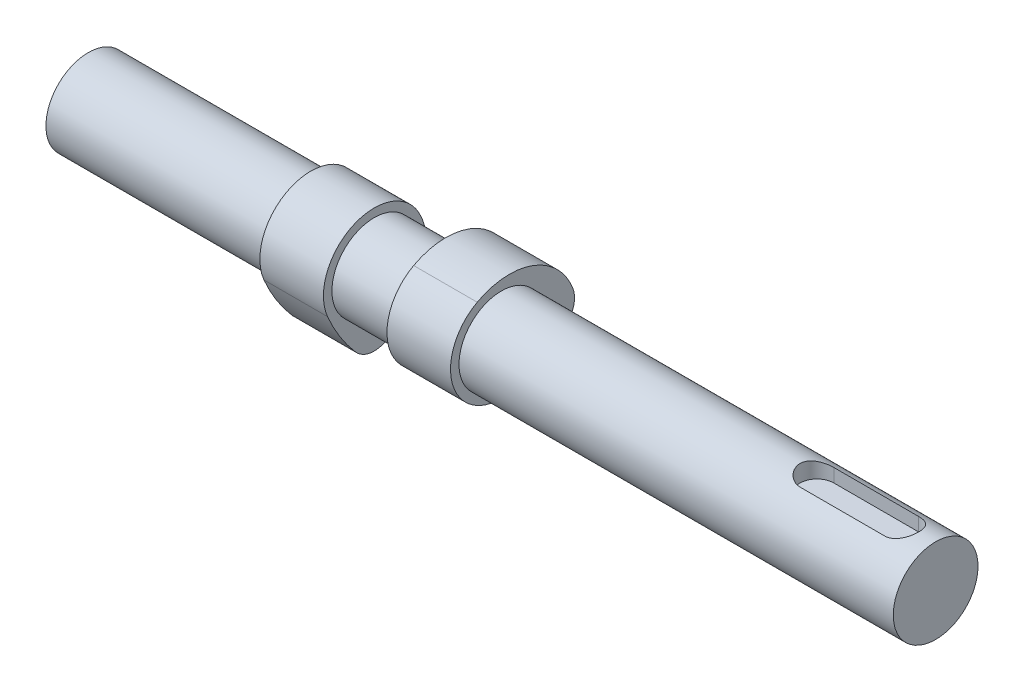
ISO-10303-21;
HEADER;
FILE_DESCRIPTION(('STEP AP214'),'2;1');
FILE_NAME('part.step','',(''),(''),'','','');
FILE_SCHEMA(('AUTOMOTIVE_DESIGN { 1 0 10303 214 1 1 1 1 }'));
ENDSEC;
DATA;
#1=APPLICATION_CONTEXT('core data for automotive mechanical design processes');
#2=APPLICATION_PROTOCOL_DEFINITION('international standard','automotive_design',2000,#1);
#3=PRODUCT_CONTEXT('',#1,'mechanical');
#4=PRODUCT('Part','Part','',(#3));
#5=PRODUCT_RELATED_PRODUCT_CATEGORY('part','',(#4));
#6=PRODUCT_DEFINITION_FORMATION('','',#4);
#7=PRODUCT_DEFINITION_CONTEXT('part definition',#1,'design');
#8=PRODUCT_DEFINITION('design','',#6,#7);
#9=PRODUCT_DEFINITION_SHAPE('','',#8);
#10=(LENGTH_UNIT() NAMED_UNIT(*) SI_UNIT(.MILLI.,.METRE.));
#11=(NAMED_UNIT(*) PLANE_ANGLE_UNIT() SI_UNIT($,.RADIAN.));
#12=(NAMED_UNIT(*) SI_UNIT($,.STERADIAN.) SOLID_ANGLE_UNIT());
#13=UNCERTAINTY_MEASURE_WITH_UNIT(LENGTH_MEASURE(1.E-05),#10,'distance_accuracy_value','');
#14=(GEOMETRIC_REPRESENTATION_CONTEXT(3) GLOBAL_UNCERTAINTY_ASSIGNED_CONTEXT((#13)) GLOBAL_UNIT_ASSIGNED_CONTEXT((#10,
#11,#12)) REPRESENTATION_CONTEXT('',''));
#15=CARTESIAN_POINT('',(0.,0.,0.));
#16=DIRECTION('',(0.,0.,1.));
#17=DIRECTION('',(1.,0.,0.));
#18=AXIS2_PLACEMENT_3D('',#15,#16,#17);
#19=CARTESIAN_POINT('',(-22.5,-1.90083734531653,3.51949106926698));
#20=DIRECTION('',(1.,0.,0.));
#21=DIRECTION('',(0.,1.,0.));
#22=AXIS2_PLACEMENT_3D('',#19,#20,#21);
#23=CYLINDRICAL_SURFACE('',#22,16.);
#24=CARTESIAN_POINT('',(-7.5,-1.90083734531653,3.51949106926698));
#25=DIRECTION('',(1.,0.,0.));
#26=DIRECTION('',(0.,1.,0.));
#27=AXIS2_PLACEMENT_3D('',#24,#25,#26);
#28=CIRCLE('',#27,16.);
#29=CARTESIAN_POINT('',(-7.5,-16.9082165253208,-2.0283526693017));
#30=VERTEX_POINT('',#29);
#31=CARTESIAN_POINT('',(-7.5,5.70251203594959,-10.5584732078009));
#32=VERTEX_POINT('',#31);
#33=EDGE_CURVE('E121',#30,#32,#28,.T.);
#34=ORIENTED_EDGE('',*,*,#33,.F.);
#35=DIRECTION('',(1.,0.,0.));
#36=VECTOR('',#35,1.);
#37=CARTESIAN_POINT('',(-22.5,-16.9082165253208,-2.0283526693017));
#38=LINE('',#37,#36);
#39=CARTESIAN_POINT('',(-22.5,-16.9082165253208,-2.0283526693017));
#40=VERTEX_POINT('',#39);
#41=EDGE_CURVE('E120',#40,#30,#38,.T.);
#42=ORIENTED_EDGE('',*,*,#41,.F.);
#43=CARTESIAN_POINT('',(-22.5,-1.90083734531653,3.51949106926698));
#44=DIRECTION('',(1.,0.,0.));
#45=DIRECTION('',(0.,1.,0.));
#46=AXIS2_PLACEMENT_3D('',#43,#44,#45);
#47=CIRCLE('',#46,16.);
#48=CARTESIAN_POINT('',(-22.5,5.70251203594959,-10.5584732078009));
#49=VERTEX_POINT('',#48);
#50=EDGE_CURVE('E115',#40,#49,#47,.T.);
#51=ORIENTED_EDGE('',*,*,#50,.T.);
#52=DIRECTION('',(1.,0.,0.));
#53=VECTOR('',#52,1.);
#54=CARTESIAN_POINT('',(-22.5,5.70251203594959,-10.5584732078009));
#55=LINE('',#54,#53);
#56=EDGE_CURVE('E12',#49,#32,#55,.T.);
#57=ORIENTED_EDGE('',*,*,#56,.T.);
#58=EDGE_LOOP('',(#34,#42,#51,#57));
#59=FACE_BOUND('',#58,.T.);
#60=ADVANCED_FACE('F58',(#59),#23,.T.);
#61=CARTESIAN_POINT('',(-22.5,0.,0.));
#62=DIRECTION('',(1.,0.,0.));
#63=DIRECTION('',(0.,1.,0.));
#64=AXIS2_PLACEMENT_3D('',#61,#62,#63);
#65=CYLINDRICAL_SURFACE('',#64,12.);
#66=CARTESIAN_POINT('',(-7.5,0.,0.));
#67=DIRECTION('',(1.,0.,0.));
#68=DIRECTION('',(0.,-1.,0.));
#69=AXIS2_PLACEMENT_3D('',#66,#67,#68);
#70=CIRCLE('',#69,12.);
#71=CARTESIAN_POINT('',(-7.5,-4.72405507257353,11.0310155321843));
#72=VERTEX_POINT('',#71);
#73=EDGE_CURVE('E123',#32,#72,#70,.T.);
#74=ORIENTED_EDGE('',*,*,#73,.F.);
#75=ORIENTED_EDGE('',*,*,#56,.F.);
#76=CARTESIAN_POINT('',(-22.5,0.,0.));
#77=DIRECTION('',(1.,0.,0.));
#78=DIRECTION('',(0.,-1.,0.));
#79=AXIS2_PLACEMENT_3D('',#76,#77,#78);
#80=CIRCLE('',#79,12.);
#81=CARTESIAN_POINT('',(-22.5,-4.72405507257353,11.0310155321843));
#82=VERTEX_POINT('',#81);
#83=EDGE_CURVE('E99',#49,#82,#80,.T.);
#84=ORIENTED_EDGE('',*,*,#83,.T.);
#85=DIRECTION('',(1.,0.,0.));
#86=VECTOR('',#85,1.);
#87=CARTESIAN_POINT('',(-22.5,-4.72405507257353,11.0310155321843));
#88=LINE('',#87,#86);
#89=EDGE_CURVE('E66',#82,#72,#88,.T.);
#90=ORIENTED_EDGE('',*,*,#89,.T.);
#91=EDGE_LOOP('',(#74,#75,#84,#90));
#92=FACE_BOUND('',#91,.T.);
#93=ADVANCED_FACE('F113',(#92),#65,.T.);
#94=CARTESIAN_POINT('',(-22.5,11.0227951693382,-25.7390362417635));
#95=DIRECTION('',(1.,0.,0.));
#96=DIRECTION('',(0.,1.,0.));
#97=AXIS2_PLACEMENT_3D('',#94,#95,#96);
#98=CYLINDRICAL_SURFACE('',#97,40.);
#99=CARTESIAN_POINT('',(-7.5,11.0227951693382,-25.7390362417635));
#100=DIRECTION('',(1.,0.,0.));
#101=DIRECTION('',(0.,-1.,0.));
#102=AXIS2_PLACEMENT_3D('',#99,#100,#101);
#103=CIRCLE('',#102,40.);
#104=CARTESIAN_POINT('',(-7.5,-15.2659329020058,4.40897822670404));
#105=VERTEX_POINT('',#104);
#106=EDGE_CURVE('E109',#72,#105,#103,.T.);
#107=ORIENTED_EDGE('',*,*,#106,.F.);
#108=ORIENTED_EDGE('',*,*,#89,.F.);
#109=CARTESIAN_POINT('',(-22.5,11.0227951693382,-25.7390362417635));
#110=DIRECTION('',(1.,0.,0.));
#111=DIRECTION('',(0.,-1.,0.));
#112=AXIS2_PLACEMENT_3D('',#109,#110,#111);
#113=CIRCLE('',#112,40.);
#114=CARTESIAN_POINT('',(-22.5,-15.2659329020058,4.40897822670404));
#115=VERTEX_POINT('',#114);
#116=EDGE_CURVE('E102',#82,#115,#113,.T.);
#117=ORIENTED_EDGE('',*,*,#116,.T.);
#118=DIRECTION('',(1.,0.,0.));
#119=VECTOR('',#118,1.);
#120=CARTESIAN_POINT('',(-22.5,-15.2659329020058,4.40897822670404));
#121=LINE('',#120,#119);
#122=EDGE_CURVE('E112',#115,#105,#121,.T.);
#123=ORIENTED_EDGE('',*,*,#122,.T.);
#124=EDGE_LOOP('',(#107,#108,#117,#123));
#125=FACE_BOUND('',#124,.T.);
#126=ADVANCED_FACE('F108',(#125),#98,.T.);
#127=CARTESIAN_POINT('',(-22.5,-11.4213536911418,0.));
#128=DIRECTION('',(1.,0.,0.));
#129=DIRECTION('',(0.,1.,0.));
#130=AXIS2_PLACEMENT_3D('',#127,#128,#129);
#131=CYLINDRICAL_SURFACE('',#130,5.84977591982444);
#132=CARTESIAN_POINT('',(-7.5,-11.4213536911418,0.));
#133=DIRECTION('',(1.,0.,0.));
#134=DIRECTION('',(0.,-1.,0.));
#135=AXIS2_PLACEMENT_3D('',#132,#133,#134);
#136=CIRCLE('',#135,5.84977591982444);
#137=EDGE_CURVE('E88',#105,#30,#136,.T.);
#138=ORIENTED_EDGE('',*,*,#137,.F.);
#139=ORIENTED_EDGE('',*,*,#122,.F.);
#140=CARTESIAN_POINT('',(-22.5,-11.4213536911418,0.));
#141=DIRECTION('',(1.,0.,0.));
#142=DIRECTION('',(0.,-1.,0.));
#143=AXIS2_PLACEMENT_3D('',#140,#141,#142);
#144=CIRCLE('',#143,5.84977591982444);
#145=EDGE_CURVE('E74',#115,#40,#144,.T.);
#146=ORIENTED_EDGE('',*,*,#145,.T.);
#147=ORIENTED_EDGE('',*,*,#41,.T.);
#148=EDGE_LOOP('',(#138,#139,#146,#147));
#149=FACE_BOUND('',#148,.T.);
#150=ADVANCED_FACE('F132',(#149),#131,.T.);
#151=CARTESIAN_POINT('',(-22.5,-6.66109551822916,1.75974553463351));
#152=DIRECTION('',(1.,0.,0.));
#153=DIRECTION('',(0.,1.,0.));
#154=AXIS2_PLACEMENT_3D('',#151,#152,#153);
#155=PLANE('',#154);
#156=ORIENTED_EDGE('',*,*,#50,.F.);
#157=ORIENTED_EDGE('',*,*,#145,.F.);
#158=ORIENTED_EDGE('',*,*,#116,.F.);
#159=ORIENTED_EDGE('',*,*,#83,.F.);
#160=EDGE_LOOP('',(#156,#157,#158,#159));
#161=FACE_BOUND('',#160,.T.);
#162=ADVANCED_FACE('F104',(#161),#155,.F.);
#163=CARTESIAN_POINT('',(-7.5,-6.66109551822916,1.75974553463351));
#164=DIRECTION('',(1.,0.,0.));
#165=DIRECTION('',(0.,1.,0.));
#166=AXIS2_PLACEMENT_3D('',#163,#164,#165);
#167=PLANE('',#166);
#168=ORIENTED_EDGE('',*,*,#33,.T.);
#169=ORIENTED_EDGE('',*,*,#73,.T.);
#170=ORIENTED_EDGE('',*,*,#106,.T.);
#171=ORIENTED_EDGE('',*,*,#137,.T.);
#172=EDGE_LOOP('',(#168,#169,#170,#171));
#173=FACE_BOUND('',#172,.T.);
#174=ADVANCED_FACE('F128',(#173),#167,.T.);
#175=CLOSED_SHELL('',(#60,#93,#126,#150,#162,#174));
#176=MANIFOLD_SOLID_BREP('B2',#175);
#177=CARTESIAN_POINT('',(22.5,-3.51949106926697,-1.90083734531654));
#178=DIRECTION('',(-1.,0.,0.));
#179=DIRECTION('',(0.,0.,1.));
#180=AXIS2_PLACEMENT_3D('',#177,#178,#179);
#181=CYLINDRICAL_SURFACE('',#180,16.);
#182=CARTESIAN_POINT('',(7.5,-3.51949106926697,-1.90083734531654));
#183=DIRECTION('',(1.,0.,0.));
#184=DIRECTION('',(0.,0.,1.));
#185=AXIS2_PLACEMENT_3D('',#182,#183,#184);
#186=CIRCLE('',#185,16.);
#187=CARTESIAN_POINT('',(7.5,2.02835266930176,-16.9082165253207));
#188=VERTEX_POINT('',#187);
#189=CARTESIAN_POINT('',(7.5,10.5584732078009,5.70251203594963));
#190=VERTEX_POINT('',#189);
#191=EDGE_CURVE('E290',#188,#190,#186,.T.);
#192=ORIENTED_EDGE('',*,*,#191,.T.);
#193=DIRECTION('',(-1.,0.,0.));
#194=VECTOR('',#193,1.);
#195=CARTESIAN_POINT('',(22.5,10.5584732078009,5.70251203594963));
#196=LINE('',#195,#194);
#197=CARTESIAN_POINT('',(22.5,10.5584732078009,5.70251203594963));
#198=VERTEX_POINT('',#197);
#199=EDGE_CURVE('E56',#198,#190,#196,.T.);
#200=ORIENTED_EDGE('',*,*,#199,.F.);
#201=CARTESIAN_POINT('',(22.5,-3.51949106926697,-1.90083734531654));
#202=DIRECTION('',(1.,0.,0.));
#203=DIRECTION('',(0.,0.,1.));
#204=AXIS2_PLACEMENT_3D('',#201,#202,#203);
#205=CIRCLE('',#204,16.);
#206=CARTESIAN_POINT('',(22.5,2.02835266930176,-16.9082165253207));
#207=VERTEX_POINT('',#206);
#208=EDGE_CURVE('E278',#207,#198,#205,.T.);
#209=ORIENTED_EDGE('',*,*,#208,.F.);
#210=DIRECTION('',(-1.,0.,0.));
#211=VECTOR('',#210,1.);
#212=CARTESIAN_POINT('',(22.5,2.02835266930176,-16.9082165253207));
#213=LINE('',#212,#211);
#214=EDGE_CURVE('E286',#207,#188,#213,.T.);
#215=ORIENTED_EDGE('',*,*,#214,.T.);
#216=EDGE_LOOP('',(#192,#200,#209,#215));
#217=FACE_BOUND('',#216,.T.);
#218=ADVANCED_FACE('F227',(#217),#181,.T.);
#219=CARTESIAN_POINT('',(22.5,0.,0.));
#220=DIRECTION('',(-1.,0.,0.));
#221=DIRECTION('',(0.,0.,1.));
#222=AXIS2_PLACEMENT_3D('',#219,#220,#221);
#223=CYLINDRICAL_SURFACE('',#222,12.);
#224=CARTESIAN_POINT('',(7.5,0.,0.));
#225=DIRECTION('',(1.,0.,0.));
#226=DIRECTION('',(0.,0.,-1.));
#227=AXIS2_PLACEMENT_3D('',#224,#225,#226);
#228=CIRCLE('',#227,12.);
#229=CARTESIAN_POINT('',(7.5,-11.0310155321843,-4.72405507257357));
#230=VERTEX_POINT('',#229);
#231=EDGE_CURVE('E282',#190,#230,#228,.T.);
#232=ORIENTED_EDGE('',*,*,#231,.T.);
#233=DIRECTION('',(-1.,0.,0.));
#234=VECTOR('',#233,1.);
#235=CARTESIAN_POINT('',(22.5,-11.0310155321843,-4.72405507257357));
#236=LINE('',#235,#234);
#237=CARTESIAN_POINT('',(22.5,-11.0310155321843,-4.72405507257357));
#238=VERTEX_POINT('',#237);
#239=EDGE_CURVE('E235',#238,#230,#236,.T.);
#240=ORIENTED_EDGE('',*,*,#239,.F.);
#241=CARTESIAN_POINT('',(22.5,0.,0.));
#242=DIRECTION('',(1.,0.,0.));
#243=DIRECTION('',(0.,0.,-1.));
#244=AXIS2_PLACEMENT_3D('',#241,#242,#243);
#245=CIRCLE('',#244,12.);
#246=EDGE_CURVE('E273',#198,#238,#245,.T.);
#247=ORIENTED_EDGE('',*,*,#246,.F.);
#248=ORIENTED_EDGE('',*,*,#199,.T.);
#249=EDGE_LOOP('',(#232,#240,#247,#248));
#250=FACE_BOUND('',#249,.T.);
#251=ADVANCED_FACE('F281',(#250),#223,.T.);
#252=CARTESIAN_POINT('',(22.5,25.7390362417634,11.0227951693383));
#253=DIRECTION('',(-1.,0.,0.));
#254=DIRECTION('',(0.,0.,1.));
#255=AXIS2_PLACEMENT_3D('',#252,#253,#254);
#256=CYLINDRICAL_SURFACE('',#255,40.);
#257=CARTESIAN_POINT('',(7.5,25.7390362417634,11.0227951693383));
#258=DIRECTION('',(1.,0.,0.));
#259=DIRECTION('',(0.,0.,-1.));
#260=AXIS2_PLACEMENT_3D('',#257,#258,#259);
#261=CIRCLE('',#260,40.);
#262=CARTESIAN_POINT('',(7.5,-4.40897822670399,-15.2659329020058));
#263=VERTEX_POINT('',#262);
#264=EDGE_CURVE('E260',#230,#263,#261,.T.);
#265=ORIENTED_EDGE('',*,*,#264,.T.);
#266=DIRECTION('',(-1.,0.,0.));
#267=VECTOR('',#266,1.);
#268=CARTESIAN_POINT('',(22.5,-4.40897822670399,-15.2659329020058));
#269=LINE('',#268,#267);
#270=CARTESIAN_POINT('',(22.5,-4.40897822670399,-15.2659329020058));
#271=VERTEX_POINT('',#270);
#272=EDGE_CURVE('E283',#271,#263,#269,.T.);
#273=ORIENTED_EDGE('',*,*,#272,.F.);
#274=CARTESIAN_POINT('',(22.5,25.7390362417634,11.0227951693383));
#275=DIRECTION('',(1.,0.,0.));
#276=DIRECTION('',(0.,0.,-1.));
#277=AXIS2_PLACEMENT_3D('',#274,#275,#276);
#278=CIRCLE('',#277,40.);
#279=EDGE_CURVE('E276',#238,#271,#278,.T.);
#280=ORIENTED_EDGE('',*,*,#279,.F.);
#281=ORIENTED_EDGE('',*,*,#239,.T.);
#282=EDGE_LOOP('',(#265,#273,#280,#281));
#283=FACE_BOUND('',#282,.T.);
#284=ADVANCED_FACE('F284',(#283),#256,.T.);
#285=CARTESIAN_POINT('',(22.5,0.,-11.4213536911418));
#286=DIRECTION('',(-1.,0.,0.));
#287=DIRECTION('',(0.,0.,1.));
#288=AXIS2_PLACEMENT_3D('',#285,#286,#287);
#289=CYLINDRICAL_SURFACE('',#288,5.84977591982444);
#290=CARTESIAN_POINT('',(7.5,0.,-11.4213536911418));
#291=DIRECTION('',(1.,0.,0.));
#292=DIRECTION('',(0.,0.,-1.));
#293=AXIS2_PLACEMENT_3D('',#290,#291,#292);
#294=CIRCLE('',#293,5.84977591982444);
#295=EDGE_CURVE('E266',#263,#188,#294,.T.);
#296=ORIENTED_EDGE('',*,*,#295,.T.);
#297=ORIENTED_EDGE('',*,*,#214,.F.);
#298=CARTESIAN_POINT('',(22.5,0.,-11.4213536911418));
#299=DIRECTION('',(1.,0.,0.));
#300=DIRECTION('',(0.,0.,-1.));
#301=AXIS2_PLACEMENT_3D('',#298,#299,#300);
#302=CIRCLE('',#301,5.84977591982444);
#303=EDGE_CURVE('E243',#271,#207,#302,.T.);
#304=ORIENTED_EDGE('',*,*,#303,.F.);
#305=ORIENTED_EDGE('',*,*,#272,.T.);
#306=EDGE_LOOP('',(#296,#297,#304,#305));
#307=FACE_BOUND('',#306,.T.);
#308=ADVANCED_FACE('F297',(#307),#289,.T.);
#309=CARTESIAN_POINT('',(22.5,-1.75974553463348,-6.66109551822917));
#310=DIRECTION('',(-1.,0.,0.));
#311=DIRECTION('',(0.,0.,1.));
#312=AXIS2_PLACEMENT_3D('',#309,#310,#311);
#313=PLANE('',#312);
#314=ORIENTED_EDGE('',*,*,#208,.T.);
#315=ORIENTED_EDGE('',*,*,#246,.T.);
#316=ORIENTED_EDGE('',*,*,#279,.T.);
#317=ORIENTED_EDGE('',*,*,#303,.T.);
#318=EDGE_LOOP('',(#314,#315,#316,#317));
#319=FACE_BOUND('',#318,.T.);
#320=ADVANCED_FACE('F274',(#319),#313,.F.);
#321=CARTESIAN_POINT('',(7.5,-1.75974553463348,-6.66109551822917));
#322=DIRECTION('',(-1.,0.,0.));
#323=DIRECTION('',(0.,0.,1.));
#324=AXIS2_PLACEMENT_3D('',#321,#322,#323);
#325=PLANE('',#324);
#326=ORIENTED_EDGE('',*,*,#191,.F.);
#327=ORIENTED_EDGE('',*,*,#295,.F.);
#328=ORIENTED_EDGE('',*,*,#264,.F.);
#329=ORIENTED_EDGE('',*,*,#231,.F.);
#330=EDGE_LOOP('',(#326,#327,#328,#329));
#331=FACE_BOUND('',#330,.T.);
#332=ADVANCED_FACE('F300',(#331),#325,.T.);
#333=CLOSED_SHELL('',(#218,#251,#284,#308,#320,#332));
#334=MANIFOLD_SOLID_BREP('B6',#333);
#335=CARTESIAN_POINT('',(125.,0.,0.));
#336=DIRECTION('',(-1.,0.,0.));
#337=DIRECTION('',(0.,0.,1.));
#338=AXIS2_PLACEMENT_3D('',#335,#336,#337);
#339=CYLINDRICAL_SURFACE('',#338,10.);
#340=DIRECTION('',(-1.,0.,0.));
#341=VECTOR('',#340,1.);
#342=CARTESIAN_POINT('',(125.,9.16515138991168,4.));
#343=LINE('',#342,#341);
#344=CARTESIAN_POINT('',(117.,9.16515138991168,4.));
#345=VERTEX_POINT('',#344);
#346=CARTESIAN_POINT('',(97.,9.16515138991168,4.));
#347=VERTEX_POINT('',#346);
#348=EDGE_CURVE('E225',#345,#347,#343,.T.);
#349=ORIENTED_EDGE('',*,*,#348,.T.);
#350=CARTESIAN_POINT('',(97.,9.16515138991168,4.));
#351=CARTESIAN_POINT('',(96.8923882949458,9.16512928809544,4.00001596071938));
#352=CARTESIAN_POINT('',(96.7847886688333,9.16704612011428,3.99565782731266));
#353=CARTESIAN_POINT('',(96.5704574034612,9.17459250745478,3.9783181194646));
#354=CARTESIAN_POINT('',(96.4637254492831,9.18022064873058,3.96533982937531));
#355=CARTESIAN_POINT('',(96.2523063568937,9.19499565865171,3.930952073529));
#356=CARTESIAN_POINT('',(96.1476128319149,9.20412861441611,3.90957593640917));
#357=CARTESIAN_POINT('',(95.9405984565681,9.22560106586818,3.85863260381273));
#358=CARTESIAN_POINT('',(95.8382777514449,9.23794075728508,3.82906490834148));
#359=CARTESIAN_POINT('',(95.5361282988375,9.2791858250141,3.72853943587112));
#360=CARTESIAN_POINT('',(95.3406915386172,9.3123489831615,3.64568978920222));
#361=CARTESIAN_POINT('',(94.9664088398381,9.38624741529469,3.45096383184147));
#362=CARTESIAN_POINT('',(94.7875788940914,9.42698987727426,3.33905992673094));
#363=CARTESIAN_POINT('',(94.441475206636,9.51401998804847,3.08263671474507));
#364=CARTESIAN_POINT('',(94.2752655660996,9.56048491272144,2.93673827988501));
#365=CARTESIAN_POINT('',(93.9689194556385,9.65225581096199,2.61939292349379));
#366=CARTESIAN_POINT('',(93.8287883384928,9.69756154495612,2.44794076987999));
#367=CARTESIAN_POINT('',(93.5731872113755,9.78406834216144,2.07601181629754));
#368=CARTESIAN_POINT('',(93.4589103805898,9.82503649102096,1.87465586655104));
#369=CARTESIAN_POINT('',(93.2663118555086,9.89607888234979,1.45364828604454));
#370=CARTESIAN_POINT('',(93.1879751552067,9.92615767032247,1.23400433637532));
#371=CARTESIAN_POINT('',(93.0733175942291,9.97076629361036,0.793934884187381));
#372=CARTESIAN_POINT('',(93.0351460866969,9.98597845290694,0.574062114869032));
#373=CARTESIAN_POINT('',(92.9959430515965,10.001606202074,0.130536855092213));
#374=CARTESIAN_POINT('',(92.9948983667482,10.0020270338048,-0.0931142682526718));
#375=CARTESIAN_POINT('',(93.0289656379282,9.98843920775428,-0.524466731987228));
#376=CARTESIAN_POINT('',(93.0620499465532,9.97523973659777,-0.732358330632749));
#377=CARTESIAN_POINT('',(93.1599870009102,9.93698538393897,-1.13934964738688));
#378=CARTESIAN_POINT('',(93.2248415445704,9.91192983148495,-1.33844886722558));
#379=CARTESIAN_POINT('',(93.3852720377719,9.85193670608706,-1.72579479688348));
#380=CARTESIAN_POINT('',(93.481296395839,9.81685584875391,-1.91383264586891));
#381=CARTESIAN_POINT('',(93.7009312637048,9.74029168639969,-2.2716159956307));
#382=CARTESIAN_POINT('',(93.8245514514378,9.69880613681324,-2.4413550479227));
#383=CARTESIAN_POINT('',(94.1052800574364,9.61043706268122,-2.7695225783069));
#384=CARTESIAN_POINT('',(94.2640530171164,9.56337795745419,-2.92647922614483));
#385=CARTESIAN_POINT('',(94.6059921366628,9.47123359153046,-3.2122147086262));
#386=CARTESIAN_POINT('',(94.7891693487996,9.42614923753061,-3.34098070594789));
#387=CARTESIAN_POINT('',(95.0816356456234,9.36326134539255,-3.51186134851388));
#388=CARTESIAN_POINT('',(95.1836718383149,9.34283170142195,-3.56571263251515));
#389=CARTESIAN_POINT('',(95.3923923024092,9.30450957703985,-3.66454761505659));
#390=CARTESIAN_POINT('',(95.4990745457273,9.28661600381593,-3.70953513634086));
#391=CARTESIAN_POINT('',(95.7162289304962,9.25400250539921,-3.79016254319007));
#392=CARTESIAN_POINT('',(95.8266961700413,9.2392786427695,-3.82581403809398));
#393=CARTESIAN_POINT('',(96.0506683681487,9.2135146773091,-3.88744848158463));
#394=CARTESIAN_POINT('',(96.1641719402125,9.20247292309662,-3.91343576505911));
#395=CARTESIAN_POINT('',(96.3974454473375,9.18417798205495,-3.95619393609845));
#396=CARTESIAN_POINT('',(96.5172941945638,9.17707470750587,-3.97260125584169));
#397=CARTESIAN_POINT('',(96.758090929137,9.16754485606458,-3.99451448409732));
#398=CARTESIAN_POINT('',(96.8790381929227,9.16511539745838,-4.0000271099601));
#399=CARTESIAN_POINT('',(97.,9.16515138991168,-4.));
#400=B_SPLINE_CURVE_WITH_KNOTS('',3,(#350,#351,#352,#353,#354,#355,#356,#357,#358,#359,#360,
#361,#362,#363,#364,#365,#366,#367,#368,#369,#370,#371,#372,#373,#374,#375,#376,#377,#378,#379,
#380,#381,#382,#383,#384,#385,#386,#387,#388,#389,#390,#391,#392,#393,#394,#395,#396,#397,#398,
#399),.UNSPECIFIED.,.F.,.F.,(4,2,2,2,2,2,2,2,2,2,2,2,2,2,2,2,2,2,2,2,2,2,2,2,4),(0.,
0.322709706217834,0.645296527806424,0.966615822543774,1.28795473422461,1.9293660035182,
2.57138869889252,3.24636095994995,3.92147161082381,4.62325717855526,5.32474946398644,
5.99227753012539,6.65956903033311,7.2893783052307,7.91922322615309,8.55856353859093,
9.19812842270037,9.87963749353246,10.5614562641081,10.9125878460839,11.2635676597187,
11.6141089352909,11.964492785171,12.3274303244848,12.6901440171997),.UNSPECIFIED.);
#401=CARTESIAN_POINT('',(97.,9.16515138991168,-4.));
#402=VERTEX_POINT('',#401);
#403=EDGE_CURVE('E462',#347,#402,#400,.T.);
#404=ORIENTED_EDGE('',*,*,#403,.T.);
#405=DIRECTION('',(-1.,0.,0.));
#406=VECTOR('',#405,1.);
#407=CARTESIAN_POINT('',(125.,9.16515138991168,-4.));
#408=LINE('',#407,#406);
#409=CARTESIAN_POINT('',(117.,9.16515138991168,-4.));
#410=VERTEX_POINT('',#409);
#411=EDGE_CURVE('E395',#402,#410,#408,.F.);
#412=ORIENTED_EDGE('',*,*,#411,.T.);
#413=CARTESIAN_POINT('',(117.,9.16515138991168,-4.));
#414=CARTESIAN_POINT('',(117.107611705054,9.16512928809544,-4.00001596071937));
#415=CARTESIAN_POINT('',(117.215211331167,9.16704612011429,-3.99565782731266));
#416=CARTESIAN_POINT('',(117.429542596539,9.17459250745478,-3.9783181194646));
#417=CARTESIAN_POINT('',(117.536274550717,9.18022064873058,-3.96533982937531));
#418=CARTESIAN_POINT('',(117.747693643106,9.19499565865171,-3.93095207352899));
#419=CARTESIAN_POINT('',(117.852387168085,9.20412861441611,-3.90957593640916));
#420=CARTESIAN_POINT('',(118.059401543432,9.22560106586818,-3.85863260381273));
#421=CARTESIAN_POINT('',(118.161722248555,9.23794075728508,-3.82906490834148));
#422=CARTESIAN_POINT('',(118.463871701162,9.2791858250141,-3.72853943587112));
#423=CARTESIAN_POINT('',(118.659308461383,9.3123489831615,-3.64568978920222));
#424=CARTESIAN_POINT('',(119.033591160162,9.38624741529469,-3.45096383184147));
#425=CARTESIAN_POINT('',(119.212421105909,9.42698987727426,-3.33905992673094));
#426=CARTESIAN_POINT('',(119.558524793364,9.51401998804847,-3.08263671474506));
#427=CARTESIAN_POINT('',(119.7247344339,9.56048491272144,-2.936738279885));
#428=CARTESIAN_POINT('',(120.031080544362,9.65225581096199,-2.61939292349378));
#429=CARTESIAN_POINT('',(120.171211661507,9.69756154495612,-2.44794076987998));
#430=CARTESIAN_POINT('',(120.426812788624,9.78406834216145,-2.07601181629754));
#431=CARTESIAN_POINT('',(120.54108961941,9.82503649102096,-1.87465586655103));
#432=CARTESIAN_POINT('',(120.733688144491,9.89607888234979,-1.45364828604453));
#433=CARTESIAN_POINT('',(120.812024844793,9.92615767032247,-1.23400433637531));
#434=CARTESIAN_POINT('',(120.926682405771,9.97076629361036,-0.793934884187374));
#435=CARTESIAN_POINT('',(120.964853913303,9.98597845290694,-0.574062114869025));
#436=CARTESIAN_POINT('',(121.004056948403,10.001606202074,-0.130536855092206));
#437=CARTESIAN_POINT('',(121.005101633252,10.0020270338048,0.0931142682526781));
#438=CARTESIAN_POINT('',(120.971034362072,9.98843920775428,0.524466731987234));
#439=CARTESIAN_POINT('',(120.937950053447,9.97523973659777,0.732358330632755));
#440=CARTESIAN_POINT('',(120.84001299909,9.93698538393897,1.13934964738689));
#441=CARTESIAN_POINT('',(120.77515845543,9.91192983148495,1.33844886722558));
#442=CARTESIAN_POINT('',(120.614727962228,9.85193670608706,1.72579479688349));
#443=CARTESIAN_POINT('',(120.518703604161,9.81685584875391,1.91383264586892));
#444=CARTESIAN_POINT('',(120.299068736295,9.74029168639969,2.27161599563071));
#445=CARTESIAN_POINT('',(120.175448548562,9.69880613681324,2.4413550479227));
#446=CARTESIAN_POINT('',(119.894719942564,9.61043706268122,2.7695225783069));
#447=CARTESIAN_POINT('',(119.735946982884,9.56337795745419,2.92647922614483));
#448=CARTESIAN_POINT('',(119.394007863337,9.47123359153046,3.2122147086262));
#449=CARTESIAN_POINT('',(119.2108306512,9.42614923753061,3.34098070594789));
#450=CARTESIAN_POINT('',(118.918364354377,9.36326134539254,3.51186134851389));
#451=CARTESIAN_POINT('',(118.816328161685,9.34283170142194,3.56571263251515));
#452=CARTESIAN_POINT('',(118.607607697591,9.30450957703985,3.66454761505659));
#453=CARTESIAN_POINT('',(118.500925454273,9.28661600381593,3.70953513634086));
#454=CARTESIAN_POINT('',(118.283771069504,9.25400250539921,3.79016254319007));
#455=CARTESIAN_POINT('',(118.173303829959,9.23927864276951,3.82581403809398));
#456=CARTESIAN_POINT('',(117.949331631851,9.2135146773091,3.88744848158464));
#457=CARTESIAN_POINT('',(117.835828059787,9.20247292309662,3.91343576505912));
#458=CARTESIAN_POINT('',(117.602554552662,9.18417798205495,3.95619393609846));
#459=CARTESIAN_POINT('',(117.482705805436,9.17707470750586,3.9726012558417));
#460=CARTESIAN_POINT('',(117.241909070863,9.16754485606458,3.99451448409732));
#461=CARTESIAN_POINT('',(117.120961807077,9.16511539745838,4.0000271099601));
#462=CARTESIAN_POINT('',(117.,9.16515138991168,4.));
#463=B_SPLINE_CURVE_WITH_KNOTS('',3,(#413,#414,#415,#416,#417,#418,#419,#420,#421,#422,#423,
#424,#425,#426,#427,#428,#429,#430,#431,#432,#433,#434,#435,#436,#437,#438,#439,#440,#441,#442,
#443,#444,#445,#446,#447,#448,#449,#450,#451,#452,#453,#454,#455,#456,#457,#458,#459,#460,#461,
#462),.UNSPECIFIED.,.F.,.F.,(4,2,2,2,2,2,2,2,2,2,2,2,2,2,2,2,2,2,2,2,2,2,2,2,4),(0.,
0.322709706217834,0.645296527806424,0.96661582254376,1.28795473422461,1.9293660035182,
2.57138869889252,3.24636095994996,3.92147161082381,4.62325717855526,5.32474946398644,
5.99227753012539,6.65956903033311,7.2893783052307,7.91922322615309,8.55856353859094,
9.19812842270038,9.87963749353244,10.5614562641081,10.9125878460839,11.2635676597187,
11.6141089352909,11.964492785171,12.3274303244848,12.6901440171997),.UNSPECIFIED.);
#464=EDGE_CURVE('E402',#410,#345,#463,.T.);
#465=ORIENTED_EDGE('',*,*,#464,.T.);
#466=EDGE_LOOP('',(#349,#404,#412,#465));
#467=FACE_BOUND('',#466,.T.);
#468=CARTESIAN_POINT('',(125.,0.,0.));
#469=DIRECTION('',(1.,0.,0.));
#470=DIRECTION('',(0.,0.,-1.));
#471=AXIS2_PLACEMENT_3D('',#468,#469,#470);
#472=CIRCLE('',#471,10.);
#473=CARTESIAN_POINT('',(125.,0.,-10.));
#474=VERTEX_POINT('',#473);
#475=EDGE_CURVE('E459',#474,#474,#472,.T.);
#476=ORIENTED_EDGE('',*,*,#475,.F.);
#477=EDGE_LOOP('',(#476));
#478=FACE_BOUND('',#477,.T.);
#479=CARTESIAN_POINT('',(-75.,0.,0.));
#480=DIRECTION('',(1.,0.,0.));
#481=DIRECTION('',(0.,0.,-1.));
#482=AXIS2_PLACEMENT_3D('',#479,#480,#481);
#483=CIRCLE('',#482,10.);
#484=CARTESIAN_POINT('',(-75.,0.,-10.));
#485=VERTEX_POINT('',#484);
#486=EDGE_CURVE('E453',#485,#485,#483,.T.);
#487=ORIENTED_EDGE('',*,*,#486,.T.);
#488=EDGE_LOOP('',(#487));
#489=FACE_BOUND('',#488,.T.);
#490=ADVANCED_FACE('F387',(#467,#478,#489),#339,.T.);
#491=CARTESIAN_POINT('',(125.,0.,0.));
#492=DIRECTION('',(1.,0.,0.));
#493=DIRECTION('',(0.,0.,-1.));
#494=AXIS2_PLACEMENT_3D('',#491,#492,#493);
#495=PLANE('',#494);
#496=ORIENTED_EDGE('',*,*,#475,.T.);
#497=EDGE_LOOP('',(#496));
#498=FACE_BOUND('',#497,.T.);
#499=ADVANCED_FACE('F489',(#498),#495,.T.);
#500=CARTESIAN_POINT('',(-75.,0.,0.));
#501=DIRECTION('',(1.,0.,0.));
#502=DIRECTION('',(0.,0.,-1.));
#503=AXIS2_PLACEMENT_3D('',#500,#501,#502);
#504=PLANE('',#503);
#505=ORIENTED_EDGE('',*,*,#486,.F.);
#506=EDGE_LOOP('',(#505));
#507=FACE_BOUND('',#506,.T.);
#508=ADVANCED_FACE('F487',(#507),#504,.F.);
#509=CARTESIAN_POINT('',(117.,6.,0.));
#510=DIRECTION('',(0.,1.,0.));
#511=DIRECTION('',(0.,0.,1.));
#512=AXIS2_PLACEMENT_3D('',#509,#510,#511);
#513=CYLINDRICAL_SURFACE('',#512,4.);
#514=DIRECTION('',(0.,1.,0.));
#515=VECTOR('',#514,1.);
#516=CARTESIAN_POINT('',(117.,6.,-4.));
#517=LINE('',#516,#515);
#518=CARTESIAN_POINT('',(117.,6.,-4.));
#519=VERTEX_POINT('',#518);
#520=EDGE_CURVE('E425',#519,#410,#517,.T.);
#521=ORIENTED_EDGE('',*,*,#520,.F.);
#522=CARTESIAN_POINT('',(117.,6.,0.));
#523=DIRECTION('',(0.,1.,0.));
#524=DIRECTION('',(0.,0.,1.));
#525=AXIS2_PLACEMENT_3D('',#522,#523,#524);
#526=CIRCLE('',#525,4.);
#527=CARTESIAN_POINT('',(117.,6.,4.));
#528=VERTEX_POINT('',#527);
#529=EDGE_CURVE('E429',#528,#519,#526,.T.);
#530=ORIENTED_EDGE('',*,*,#529,.F.);
#531=DIRECTION('',(0.,1.,0.));
#532=VECTOR('',#531,1.);
#533=CARTESIAN_POINT('',(117.,6.,4.));
#534=LINE('',#533,#532);
#535=EDGE_CURVE('E451',#528,#345,#534,.T.);
#536=ORIENTED_EDGE('',*,*,#535,.T.);
#537=ORIENTED_EDGE('',*,*,#464,.F.);
#538=EDGE_LOOP('',(#521,#530,#536,#537));
#539=FACE_BOUND('',#538,.T.);
#540=ADVANCED_FACE('F427',(#539),#513,.F.);
#541=CARTESIAN_POINT('',(117.,6.,4.));
#542=DIRECTION('',(0.,0.,1.));
#543=DIRECTION('',(1.,0.,0.));
#544=AXIS2_PLACEMENT_3D('',#541,#542,#543);
#545=PLANE('',#544);
#546=ORIENTED_EDGE('',*,*,#535,.F.);
#547=DIRECTION('',(1.,0.,0.));
#548=VECTOR('',#547,1.);
#549=CARTESIAN_POINT('',(117.,6.,4.));
#550=LINE('',#549,#548);
#551=CARTESIAN_POINT('',(97.,6.,4.));
#552=VERTEX_POINT('',#551);
#553=EDGE_CURVE('E434',#552,#528,#550,.T.);
#554=ORIENTED_EDGE('',*,*,#553,.F.);
#555=DIRECTION('',(0.,1.,0.));
#556=VECTOR('',#555,1.);
#557=CARTESIAN_POINT('',(97.,6.,4.));
#558=LINE('',#557,#556);
#559=EDGE_CURVE('E454',#552,#347,#558,.T.);
#560=ORIENTED_EDGE('',*,*,#559,.T.);
#561=ORIENTED_EDGE('',*,*,#348,.F.);
#562=EDGE_LOOP('',(#546,#554,#560,#561));
#563=FACE_BOUND('',#562,.T.);
#564=ADVANCED_FACE('F480',(#563),#545,.F.);
#565=CARTESIAN_POINT('',(97.,6.,0.));
#566=DIRECTION('',(0.,1.,0.));
#567=DIRECTION('',(0.,0.,1.));
#568=AXIS2_PLACEMENT_3D('',#565,#566,#567);
#569=CYLINDRICAL_SURFACE('',#568,4.);
#570=ORIENTED_EDGE('',*,*,#559,.F.);
#571=CARTESIAN_POINT('',(97.,6.,0.));
#572=DIRECTION('',(0.,1.,0.));
#573=DIRECTION('',(0.,0.,1.));
#574=AXIS2_PLACEMENT_3D('',#571,#572,#573);
#575=CIRCLE('',#574,4.);
#576=CARTESIAN_POINT('',(97.,6.,-4.));
#577=VERTEX_POINT('',#576);
#578=EDGE_CURVE('E443',#577,#552,#575,.T.);
#579=ORIENTED_EDGE('',*,*,#578,.F.);
#580=DIRECTION('',(0.,1.,0.));
#581=VECTOR('',#580,1.);
#582=CARTESIAN_POINT('',(97.,6.,-4.));
#583=LINE('',#582,#581);
#584=EDGE_CURVE('E433',#577,#402,#583,.T.);
#585=ORIENTED_EDGE('',*,*,#584,.T.);
#586=ORIENTED_EDGE('',*,*,#403,.F.);
#587=EDGE_LOOP('',(#570,#579,#585,#586));
#588=FACE_BOUND('',#587,.T.);
#589=ADVANCED_FACE('F475',(#588),#569,.F.);
#590=CARTESIAN_POINT('',(117.,6.,-4.));
#591=DIRECTION('',(0.,0.,-1.));
#592=DIRECTION('',(-1.,0.,0.));
#593=AXIS2_PLACEMENT_3D('',#590,#591,#592);
#594=PLANE('',#593);
#595=ORIENTED_EDGE('',*,*,#584,.F.);
#596=DIRECTION('',(-1.,0.,0.));
#597=VECTOR('',#596,1.);
#598=CARTESIAN_POINT('',(117.,6.,-4.));
#599=LINE('',#598,#597);
#600=EDGE_CURVE('E437',#519,#577,#599,.T.);
#601=ORIENTED_EDGE('',*,*,#600,.F.);
#602=ORIENTED_EDGE('',*,*,#520,.T.);
#603=ORIENTED_EDGE('',*,*,#411,.F.);
#604=EDGE_LOOP('',(#595,#601,#602,#603));
#605=FACE_BOUND('',#604,.T.);
#606=ADVANCED_FACE('F438',(#605),#594,.F.);
#607=CARTESIAN_POINT('',(117.,6.,0.));
#608=DIRECTION('',(0.,1.,0.));
#609=DIRECTION('',(0.,0.,1.));
#610=AXIS2_PLACEMENT_3D('',#607,#608,#609);
#611=PLANE('',#610);
#612=ORIENTED_EDGE('',*,*,#529,.T.);
#613=ORIENTED_EDGE('',*,*,#600,.T.);
#614=ORIENTED_EDGE('',*,*,#578,.T.);
#615=ORIENTED_EDGE('',*,*,#553,.T.);
#616=EDGE_LOOP('',(#612,#613,#614,#615));
#617=FACE_BOUND('',#616,.T.);
#618=ADVANCED_FACE('F445',(#617),#611,.T.);
#619=CLOSED_SHELL('',(#490,#499,#508,#540,#564,#589,#606,#618));
#620=MANIFOLD_SOLID_BREP('B50',#619);
#621=ADVANCED_BREP_SHAPE_REPRESENTATION('',(#18,#176,#334,#620),#14);
#622=SHAPE_DEFINITION_REPRESENTATION(#9,#621);
ENDSEC;
END-ISO-10303-21;
